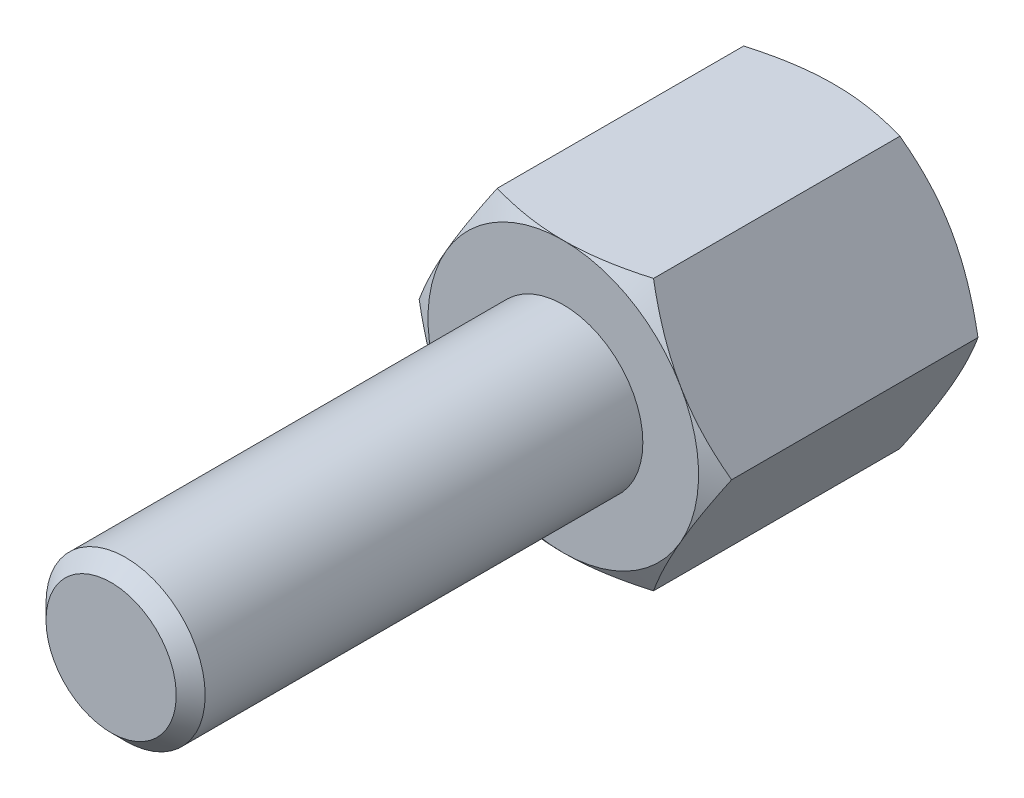
ISO-10303-21;
HEADER;
FILE_DESCRIPTION(('STEP AP214'),'2;1');
FILE_NAME('part.step','',(''),(''),'','','');
FILE_SCHEMA(('AUTOMOTIVE_DESIGN { 1 0 10303 214 1 1 1 1 }'));
ENDSEC;
DATA;
#1=APPLICATION_CONTEXT('core data for automotive mechanical design processes');
#2=APPLICATION_PROTOCOL_DEFINITION('international standard','automotive_design',2000,#1);
#3=PRODUCT_CONTEXT('',#1,'mechanical');
#4=PRODUCT('Part','Part','',(#3));
#5=PRODUCT_RELATED_PRODUCT_CATEGORY('part','',(#4));
#6=PRODUCT_DEFINITION_FORMATION('','',#4);
#7=PRODUCT_DEFINITION_CONTEXT('part definition',#1,'design');
#8=PRODUCT_DEFINITION('design','',#6,#7);
#9=PRODUCT_DEFINITION_SHAPE('','',#8);
#10=(LENGTH_UNIT() NAMED_UNIT(*) SI_UNIT(.MILLI.,.METRE.));
#11=(NAMED_UNIT(*) PLANE_ANGLE_UNIT() SI_UNIT($,.RADIAN.));
#12=(NAMED_UNIT(*) SI_UNIT($,.STERADIAN.) SOLID_ANGLE_UNIT());
#13=UNCERTAINTY_MEASURE_WITH_UNIT(LENGTH_MEASURE(1.E-05),#10,'distance_accuracy_value','');
#14=(GEOMETRIC_REPRESENTATION_CONTEXT(3) GLOBAL_UNCERTAINTY_ASSIGNED_CONTEXT((#13)) GLOBAL_UNIT_ASSIGNED_CONTEXT((#10,
#11,#12)) REPRESENTATION_CONTEXT('',''));
#15=CARTESIAN_POINT('',(0.,0.,0.));
#16=DIRECTION('',(0.,0.,1.));
#17=DIRECTION('',(1.,0.,0.));
#18=AXIS2_PLACEMENT_3D('',#15,#16,#17);
#19=CARTESIAN_POINT('',(0.,0.,3.9751));
#20=DIRECTION('',(0.,0.,-1.));
#21=DIRECTION('',(-1.,0.,0.));
#22=AXIS2_PLACEMENT_3D('',#19,#20,#21);
#23=CONICAL_SURFACE('',#22,1.0795,1.02974425867666);
#24=CARTESIAN_POINT('',(0.,0.,4.62372903824024));
#25=VERTEX_POINT('',#24);
#26=VERTEX_LOOP('',#25);
#27=FACE_BOUND('',#26,.T.);
#28=CARTESIAN_POINT('',(0.,0.,3.9751));
#29=DIRECTION('',(0.,0.,-1.));
#30=DIRECTION('',(-1.,0.,0.));
#31=AXIS2_PLACEMENT_3D('',#28,#29,#30);
#32=CIRCLE('',#31,1.0795);
#33=CARTESIAN_POINT('',(-1.0795,0.,3.9751));
#34=VERTEX_POINT('',#33);
#35=EDGE_CURVE('E123',#34,#34,#32,.T.);
#36=ORIENTED_EDGE('',*,*,#35,.T.);
#37=EDGE_LOOP('',(#36));
#38=FACE_BOUND('',#37,.T.);
#39=ADVANCED_FACE('F17',(#27,#38),#23,.F.);
#40=CARTESIAN_POINT('',(0.,0.,-2.1209));
#41=DIRECTION('',(0.,0.,1.));
#42=DIRECTION('',(0.,-1.,0.));
#43=AXIS2_PLACEMENT_3D('',#40,#41,#42);
#44=CYLINDRICAL_SURFACE('',#43,1.0795);
#45=CARTESIAN_POINT('',(0.,0.,-2.1208999998521));
#46=DIRECTION('',(0.,0.,-1.));
#47=DIRECTION('',(1.,0.,0.));
#48=AXIS2_PLACEMENT_3D('',#45,#46,#47);
#49=CIRCLE('',#48,1.0795000001167);
#50=CARTESIAN_POINT('',(1.0795000001167,0.,-2.1208999998521));
#51=VERTEX_POINT('',#50);
#52=EDGE_CURVE('E129',#51,#51,#49,.T.);
#53=ORIENTED_EDGE('',*,*,#52,.T.);
#54=EDGE_LOOP('',(#53));
#55=FACE_BOUND('',#54,.T.);
#56=ORIENTED_EDGE('',*,*,#35,.F.);
#57=EDGE_LOOP('',(#56));
#58=FACE_BOUND('',#57,.T.);
#59=ADVANCED_FACE('F119',(#55,#58),#44,.F.);
#60=CARTESIAN_POINT('',(0.,0.,-2.3749));
#61=DIRECTION('',(0.,0.,1.));
#62=DIRECTION('',(1.,0.,0.));
#63=AXIS2_PLACEMENT_3D('',#60,#61,#62);
#64=CONICAL_SURFACE('',#63,2.3749,1.04719755119661);
#65=CARTESIAN_POINT('',(0.,0.,-2.3749));
#66=DIRECTION('',(0.,0.,1.));
#67=DIRECTION('',(1.,0.,0.));
#68=AXIS2_PLACEMENT_3D('',#65,#66,#67);
#69=CIRCLE('',#68,2.3749);
#70=CARTESIAN_POINT('',(0.,-2.3749,-2.3749));
#71=VERTEX_POINT('',#70);
#72=CARTESIAN_POINT('',(2.05672373144766,-1.18745,-2.3749));
#73=VERTEX_POINT('',#72);
#74=EDGE_CURVE('E221',#71,#73,#69,.T.);
#75=ORIENTED_EDGE('',*,*,#74,.T.);
#76=CARTESIAN_POINT('',(1.37114915429844,-2.3749,-2.16278248763178));
#77=CARTESIAN_POINT('',(1.42696435756434,-2.27822523210867,-2.19500732392759));
#78=CARTESIAN_POINT('',(1.48321187165236,-2.18080167990879,-2.22453452117387));
#79=CARTESIAN_POINT('',(1.59620283284149,-1.98509559433317,-2.27660548538834));
#80=CARTESIAN_POINT('',(1.65294233813021,-1.88681988837678,-2.29918378386987));
#81=CARTESIAN_POINT('',(1.76717792611216,-1.68895804595954,-2.33614417305783));
#82=CARTESIAN_POINT('',(1.82467478144418,-1.58937057124904,-2.35051710222379));
#83=CARTESIAN_POINT('',(1.91135131890353,-1.4392424045453,-2.36506149255085));
#84=CARTESIAN_POINT('',(1.94039073995329,-1.38894465186474,-2.36874080368445));
#85=CARTESIAN_POINT('',(1.99852669435416,-1.28825022509592,-2.37366400935876));
#86=CARTESIAN_POINT('',(2.02762323787449,-1.23785353339407,-2.37490742157294));
#87=CARTESIAN_POINT('',(2.05672373144766,-1.18745,-2.3749));
#88=B_SPLINE_CURVE_WITH_KNOTS('',3,(#76,#77,#78,#79,#80,#81,#82,#83,#84,#85,#86,#87),
.UNSPECIFIED.,.F.,.F.,(4,2,2,2,2,4),(0.,0.348652732002403,0.695543818108531,1.04282146478411,
1.21736185915432,1.39193681035822),.UNSPECIFIED.);
#89=CARTESIAN_POINT('',(1.37114915429844,-2.3749,-2.16278248763178));
#90=VERTEX_POINT('',#89);
#91=EDGE_CURVE('E22',#90,#73,#88,.T.);
#92=ORIENTED_EDGE('',*,*,#91,.F.);
#93=CARTESIAN_POINT('',(0.,-2.3749,-2.3749));
#94=CARTESIAN_POINT('',(0.0582009871463456,-2.3749,-2.37490742157294));
#95=CARTESIAN_POINT('',(0.116394074187004,-2.3749,-2.37366400935876));
#96=CARTESIAN_POINT('',(0.232665982988754,-2.3749,-2.36874080368445));
#97=CARTESIAN_POINT('',(0.290744825088262,-2.3749,-2.36506149255085));
#98=CARTESIAN_POINT('',(0.464097900006965,-2.3749,-2.35051710222379));
#99=CARTESIAN_POINT('',(0.579091610671009,-2.3749,-2.33614417305783));
#100=CARTESIAN_POINT('',(0.807562786634905,-2.3749,-2.29918378386987));
#101=CARTESIAN_POINT('',(0.921041797212354,-2.3749,-2.27660548538834));
#102=CARTESIAN_POINT('',(1.14702371959061,-2.3749,-2.22453452117387));
#103=CARTESIAN_POINT('',(1.25951874776664,-2.3749,-2.19500732392759));
#104=CARTESIAN_POINT('',(1.37114915429844,-2.3749,-2.16278248763178));
#105=B_SPLINE_CURVE_WITH_KNOTS('',3,(#93,#94,#95,#96,#97,#98,#99,#100,#101,#102,#103,#104),
.UNSPECIFIED.,.F.,.F.,(4,2,2,2,2,4),(0.,0.174574951203908,0.349115345574114,0.696392992249693,
1.04328407835582,1.39193681035822),.UNSPECIFIED.);
#106=EDGE_CURVE('E113',#71,#90,#105,.T.);
#107=ORIENTED_EDGE('',*,*,#106,.F.);
#108=EDGE_LOOP('',(#75,#92,#107));
#109=FACE_BOUND('',#108,.T.);
#110=ADVANCED_FACE('F490',(#109),#64,.T.);
#111=CARTESIAN_POINT('',(0.,0.,-2.3749));
#112=DIRECTION('',(0.,0.,1.));
#113=DIRECTION('',(1.,0.,0.));
#114=AXIS2_PLACEMENT_3D('',#111,#112,#113);
#115=CONICAL_SURFACE('',#114,2.3749,1.04719755119661);
#116=CARTESIAN_POINT('',(0.,0.,-2.3749));
#117=DIRECTION('',(0.,0.,1.));
#118=DIRECTION('',(1.,0.,0.));
#119=AXIS2_PLACEMENT_3D('',#116,#117,#118);
#120=CIRCLE('',#119,2.3749);
#121=CARTESIAN_POINT('',(2.05672373144766,1.18745,-2.3749));
#122=VERTEX_POINT('',#121);
#123=CARTESIAN_POINT('',(0.,2.3749,-2.3749));
#124=VERTEX_POINT('',#123);
#125=EDGE_CURVE('E561',#122,#124,#120,.T.);
#126=ORIENTED_EDGE('',*,*,#125,.T.);
#127=CARTESIAN_POINT('',(1.37114915429844,2.3749,-2.16278248763178));
#128=CARTESIAN_POINT('',(1.25951874776664,2.3749,-2.19500732392759));
#129=CARTESIAN_POINT('',(1.14702371959061,2.3749,-2.22453452117387));
#130=CARTESIAN_POINT('',(0.921041797212353,2.3749,-2.27660548538834));
#131=CARTESIAN_POINT('',(0.807562786634905,2.3749,-2.29918378386987));
#132=CARTESIAN_POINT('',(0.579091610671009,2.3749,-2.33614417305783));
#133=CARTESIAN_POINT('',(0.464097900006964,2.3749,-2.35051710222379));
#134=CARTESIAN_POINT('',(0.290744825088261,2.3749,-2.36506149255085));
#135=CARTESIAN_POINT('',(0.232665982988753,2.3749,-2.36874080368445));
#136=CARTESIAN_POINT('',(0.116394074187004,2.3749,-2.37366400935876));
#137=CARTESIAN_POINT('',(0.0582009871463452,2.3749,-2.37490742157294));
#138=CARTESIAN_POINT('',(0.,2.3749,-2.3749));
#139=B_SPLINE_CURVE_WITH_KNOTS('',3,(#127,#128,#129,#130,#131,#132,#133,#134,#135,#136,#137,
#138),.UNSPECIFIED.,.F.,.F.,(4,2,2,2,2,4),(0.,0.348652732002403,0.69554381810853,
1.04282146478411,1.21736185915432,1.39193681035822),.UNSPECIFIED.);
#140=CARTESIAN_POINT('',(1.37114915429844,2.3749,-2.16278248763178));
#141=VERTEX_POINT('',#140);
#142=EDGE_CURVE('E517',#141,#124,#139,.T.);
#143=ORIENTED_EDGE('',*,*,#142,.F.);
#144=CARTESIAN_POINT('',(2.05672373144766,1.18745,-2.3749));
#145=CARTESIAN_POINT('',(2.02762323787449,1.23785353339407,-2.37490742157294));
#146=CARTESIAN_POINT('',(1.99852669435416,1.28825022509592,-2.37366400935876));
#147=CARTESIAN_POINT('',(1.94039073995329,1.38894465186474,-2.36874080368445));
#148=CARTESIAN_POINT('',(1.91135131890353,1.4392424045453,-2.36506149255085));
#149=CARTESIAN_POINT('',(1.82467478144418,1.58937057124904,-2.35051710222379));
#150=CARTESIAN_POINT('',(1.76717792611216,1.68895804595954,-2.33614417305783));
#151=CARTESIAN_POINT('',(1.65294233813021,1.88681988837678,-2.29918378386987));
#152=CARTESIAN_POINT('',(1.59620283284149,1.98509559433317,-2.27660548538834));
#153=CARTESIAN_POINT('',(1.48321187165236,2.18080167990879,-2.22453452117387));
#154=CARTESIAN_POINT('',(1.42696435756434,2.27822523210867,-2.19500732392759));
#155=CARTESIAN_POINT('',(1.37114915429844,2.3749,-2.16278248763178));
#156=B_SPLINE_CURVE_WITH_KNOTS('',3,(#144,#145,#146,#147,#148,#149,#150,#151,#152,#153,#154,
#155),.UNSPECIFIED.,.F.,.F.,(4,2,2,2,2,4),(0.,0.174574951203908,0.349115345574114,
0.696392992249693,1.04328407835582,1.39193681035822),.UNSPECIFIED.);
#157=EDGE_CURVE('E521',#122,#141,#156,.T.);
#158=ORIENTED_EDGE('',*,*,#157,.F.);
#159=EDGE_LOOP('',(#126,#143,#158));
#160=FACE_BOUND('',#159,.T.);
#161=ADVANCED_FACE('F483',(#160),#115,.T.);
#162=CARTESIAN_POINT('',(0.,0.,-2.3749));
#163=DIRECTION('',(0.,0.,1.));
#164=DIRECTION('',(1.,0.,0.));
#165=AXIS2_PLACEMENT_3D('',#162,#163,#164);
#166=CONICAL_SURFACE('',#165,2.3749,1.04719755119661);
#167=CARTESIAN_POINT('',(0.,0.,-2.3749));
#168=DIRECTION('',(0.,0.,1.));
#169=DIRECTION('',(1.,0.,0.));
#170=AXIS2_PLACEMENT_3D('',#167,#168,#169);
#171=CIRCLE('',#170,2.3749);
#172=CARTESIAN_POINT('',(-2.05672373144766,1.18745,-2.3749));
#173=VERTEX_POINT('',#172);
#174=EDGE_CURVE('E549',#124,#173,#171,.T.);
#175=ORIENTED_EDGE('',*,*,#174,.T.);
#176=CARTESIAN_POINT('',(-1.37114915429844,2.3749,-2.16278248763178));
#177=CARTESIAN_POINT('',(-1.42696435756434,2.27822523210867,-2.19500732392759));
#178=CARTESIAN_POINT('',(-1.48321187165236,2.18080167990879,-2.22453452117387));
#179=CARTESIAN_POINT('',(-1.59620283284149,1.98509559433317,-2.27660548538834));
#180=CARTESIAN_POINT('',(-1.65294233813021,1.88681988837678,-2.29918378386987));
#181=CARTESIAN_POINT('',(-1.76717792611216,1.68895804595954,-2.33614417305783));
#182=CARTESIAN_POINT('',(-1.82467478144418,1.58937057124904,-2.35051710222379));
#183=CARTESIAN_POINT('',(-1.91135131890353,1.4392424045453,-2.36506149255085));
#184=CARTESIAN_POINT('',(-1.94039073995329,1.38894465186474,-2.36874080368445));
#185=CARTESIAN_POINT('',(-1.99852669435416,1.28825022509592,-2.37366400935876));
#186=CARTESIAN_POINT('',(-2.02762323787449,1.23785353339407,-2.37490742157294));
#187=CARTESIAN_POINT('',(-2.05672373144766,1.18745,-2.3749));
#188=B_SPLINE_CURVE_WITH_KNOTS('',3,(#176,#177,#178,#179,#180,#181,#182,#183,#184,#185,#186,
#187),.UNSPECIFIED.,.F.,.F.,(4,2,2,2,2,4),(0.,0.348652732002402,0.69554381810853,
1.04282146478411,1.21736185915432,1.39193681035822),.UNSPECIFIED.);
#189=CARTESIAN_POINT('',(-1.37114915429844,2.3749,-2.16278248763178));
#190=VERTEX_POINT('',#189);
#191=EDGE_CURVE('E526',#190,#173,#188,.T.);
#192=ORIENTED_EDGE('',*,*,#191,.F.);
#193=CARTESIAN_POINT('',(0.,2.3749,-2.3749));
#194=CARTESIAN_POINT('',(-0.0582009871463459,2.3749,-2.37490742157294));
#195=CARTESIAN_POINT('',(-0.116394074187004,2.3749,-2.37366400935876));
#196=CARTESIAN_POINT('',(-0.232665982988754,2.3749,-2.36874080368445));
#197=CARTESIAN_POINT('',(-0.290744825088262,2.3749,-2.36506149255085));
#198=CARTESIAN_POINT('',(-0.464097900006965,2.3749,-2.35051710222379));
#199=CARTESIAN_POINT('',(-0.579091610671009,2.3749,-2.33614417305783));
#200=CARTESIAN_POINT('',(-0.807562786634906,2.3749,-2.29918378386987));
#201=CARTESIAN_POINT('',(-0.921041797212354,2.3749,-2.27660548538834));
#202=CARTESIAN_POINT('',(-1.14702371959061,2.3749,-2.22453452117387));
#203=CARTESIAN_POINT('',(-1.25951874776664,2.3749,-2.19500732392759));
#204=CARTESIAN_POINT('',(-1.37114915429844,2.3749,-2.16278248763178));
#205=B_SPLINE_CURVE_WITH_KNOTS('',3,(#193,#194,#195,#196,#197,#198,#199,#200,#201,#202,#203,
#204),.UNSPECIFIED.,.F.,.F.,(4,2,2,2,2,4),(0.,0.174574951203908,0.349115345574114,
0.696392992249693,1.04328407835582,1.39193681035822),.UNSPECIFIED.);
#206=EDGE_CURVE('E530',#124,#190,#205,.T.);
#207=ORIENTED_EDGE('',*,*,#206,.F.);
#208=EDGE_LOOP('',(#175,#192,#207));
#209=FACE_BOUND('',#208,.T.);
#210=ADVANCED_FACE('F206',(#209),#166,.T.);
#211=CARTESIAN_POINT('',(0.,0.,-2.3749));
#212=DIRECTION('',(0.,0.,1.));
#213=DIRECTION('',(1.,0.,0.));
#214=AXIS2_PLACEMENT_3D('',#211,#212,#213);
#215=CONICAL_SURFACE('',#214,2.3749,1.04719755119661);
#216=CARTESIAN_POINT('',(-2.74229830859688,0.,-2.16278248763178));
#217=CARTESIAN_POINT('',(-2.68648310533098,-0.0966747678913262,-2.19500732392759));
#218=CARTESIAN_POINT('',(-2.63023559124297,-0.194098320091214,-2.22453452117387));
#219=CARTESIAN_POINT('',(-2.51724463005384,-0.389804405666826,-2.27660548538834));
#220=CARTESIAN_POINT('',(-2.46050512476512,-0.488080111623219,-2.29918378386987));
#221=CARTESIAN_POINT('',(-2.34626953678317,-0.685941954040458,-2.33614417305783));
#222=CARTESIAN_POINT('',(-2.28877268145115,-0.785529428750958,-2.35051710222379));
#223=CARTESIAN_POINT('',(-2.20209614399179,-0.935657595454702,-2.36506149255085));
#224=CARTESIAN_POINT('',(-2.17305672294204,-0.985955348135261,-2.36874080368445));
#225=CARTESIAN_POINT('',(-2.11492076854117,-1.08664977490408,-2.37366400935876));
#226=CARTESIAN_POINT('',(-2.08582422502084,-1.13704646660593,-2.37490742157294));
#227=CARTESIAN_POINT('',(-2.05672373144766,-1.18745,-2.3749));
#228=B_SPLINE_CURVE_WITH_KNOTS('',3,(#216,#217,#218,#219,#220,#221,#222,#223,#224,#225,#226,
#227),.UNSPECIFIED.,.F.,.F.,(4,2,2,2,2,4),(0.,0.348652732002403,0.69554381810853,
1.04282146478411,1.21736185915432,1.39193681035822),.UNSPECIFIED.);
#229=CARTESIAN_POINT('',(-2.74229830859688,0.,-2.16278248763178));
#230=VERTEX_POINT('',#229);
#231=CARTESIAN_POINT('',(-2.05672373144766,-1.18745,-2.3749));
#232=VERTEX_POINT('',#231);
#233=EDGE_CURVE('E190',#230,#232,#228,.T.);
#234=ORIENTED_EDGE('',*,*,#233,.F.);
#235=CARTESIAN_POINT('',(-2.05672373144766,1.18745,-2.3749));
#236=CARTESIAN_POINT('',(-2.08582422502084,1.13704646660593,-2.37490742157294));
#237=CARTESIAN_POINT('',(-2.11492076854117,1.08664977490408,-2.37366400935876));
#238=CARTESIAN_POINT('',(-2.17305672294204,0.985955348135262,-2.36874080368445));
#239=CARTESIAN_POINT('',(-2.20209614399179,0.935657595454703,-2.36506149255085));
#240=CARTESIAN_POINT('',(-2.28877268145115,0.785529428750959,-2.35051710222379));
#241=CARTESIAN_POINT('',(-2.34626953678317,0.685941954040459,-2.33614417305783));
#242=CARTESIAN_POINT('',(-2.46050512476512,0.48808011162322,-2.29918378386987));
#243=CARTESIAN_POINT('',(-2.51724463005384,0.389804405666827,-2.27660548538834));
#244=CARTESIAN_POINT('',(-2.63023559124297,0.194098320091214,-2.22453452117387));
#245=CARTESIAN_POINT('',(-2.68648310533098,0.0966747678913266,-2.19500732392759));
#246=CARTESIAN_POINT('',(-2.74229830859688,0.,-2.16278248763178));
#247=B_SPLINE_CURVE_WITH_KNOTS('',3,(#235,#236,#237,#238,#239,#240,#241,#242,#243,#244,#245,
#246),.UNSPECIFIED.,.F.,.F.,(4,2,2,2,2,4),(0.,0.174574951203908,0.349115345574114,
0.696392992249693,1.04328407835582,1.39193681035822),.UNSPECIFIED.);
#248=EDGE_CURVE('E196',#173,#230,#247,.T.);
#249=ORIENTED_EDGE('',*,*,#248,.F.);
#250=CARTESIAN_POINT('',(0.,0.,-2.3749));
#251=DIRECTION('',(0.,0.,1.));
#252=DIRECTION('',(1.,0.,0.));
#253=AXIS2_PLACEMENT_3D('',#250,#251,#252);
#254=CIRCLE('',#253,2.3749);
#255=EDGE_CURVE('E543',#173,#232,#254,.T.);
#256=ORIENTED_EDGE('',*,*,#255,.T.);
#257=EDGE_LOOP('',(#234,#249,#256));
#258=FACE_BOUND('',#257,.T.);
#259=ADVANCED_FACE('F201',(#258),#215,.T.);
#260=CARTESIAN_POINT('',(0.,0.,-2.3749));
#261=DIRECTION('',(0.,0.,1.));
#262=DIRECTION('',(1.,0.,0.));
#263=AXIS2_PLACEMENT_3D('',#260,#261,#262);
#264=CONICAL_SURFACE('',#263,2.3749,1.04719755119661);
#265=CARTESIAN_POINT('',(-1.37114915429844,-2.3749,-2.16278248763178));
#266=CARTESIAN_POINT('',(-1.25951874776664,-2.3749,-2.19500732392759));
#267=CARTESIAN_POINT('',(-1.14702371959061,-2.3749,-2.22453452117387));
#268=CARTESIAN_POINT('',(-0.921041797212353,-2.3749,-2.27660548538834));
#269=CARTESIAN_POINT('',(-0.807562786634905,-2.3749,-2.29918378386987));
#270=CARTESIAN_POINT('',(-0.579091610671009,-2.3749,-2.33614417305783));
#271=CARTESIAN_POINT('',(-0.464097900006964,-2.3749,-2.35051710222379));
#272=CARTESIAN_POINT('',(-0.290744825088261,-2.3749,-2.36506149255085));
#273=CARTESIAN_POINT('',(-0.232665982988753,-2.3749,-2.36874080368445));
#274=CARTESIAN_POINT('',(-0.116394074187004,-2.3749,-2.37366400935876));
#275=CARTESIAN_POINT('',(-0.0582009871463451,-2.3749,-2.37490742157294));
#276=CARTESIAN_POINT('',(0.,-2.3749,-2.3749));
#277=B_SPLINE_CURVE_WITH_KNOTS('',3,(#265,#266,#267,#268,#269,#270,#271,#272,#273,#274,#275,
#276),.UNSPECIFIED.,.F.,.F.,(4,2,2,2,2,4),(0.,0.348652732002403,0.695543818108531,
1.04282146478411,1.21736185915432,1.39193681035822),.UNSPECIFIED.);
#278=CARTESIAN_POINT('',(-1.37114915429844,-2.3749,-2.16278248763178));
#279=VERTEX_POINT('',#278);
#280=EDGE_CURVE('E216',#279,#71,#277,.T.);
#281=ORIENTED_EDGE('',*,*,#280,.F.);
#282=CARTESIAN_POINT('',(-2.05672373144766,-1.18745,-2.3749));
#283=CARTESIAN_POINT('',(-2.02762323787449,-1.23785353339407,-2.37490742157294));
#284=CARTESIAN_POINT('',(-1.99852669435416,-1.28825022509592,-2.37366400935876));
#285=CARTESIAN_POINT('',(-1.94039073995329,-1.38894465186474,-2.36874080368445));
#286=CARTESIAN_POINT('',(-1.91135131890353,-1.4392424045453,-2.36506149255085));
#287=CARTESIAN_POINT('',(-1.82467478144418,-1.58937057124904,-2.35051710222379));
#288=CARTESIAN_POINT('',(-1.76717792611216,-1.68895804595954,-2.33614417305783));
#289=CARTESIAN_POINT('',(-1.65294233813021,-1.88681988837678,-2.29918378386987));
#290=CARTESIAN_POINT('',(-1.59620283284149,-1.98509559433317,-2.27660548538834));
#291=CARTESIAN_POINT('',(-1.48321187165236,-2.18080167990879,-2.22453452117387));
#292=CARTESIAN_POINT('',(-1.42696435756434,-2.27822523210867,-2.19500732392759));
#293=CARTESIAN_POINT('',(-1.37114915429844,-2.3749,-2.16278248763178));
#294=B_SPLINE_CURVE_WITH_KNOTS('',3,(#282,#283,#284,#285,#286,#287,#288,#289,#290,#291,#292,
#293),.UNSPECIFIED.,.F.,.F.,(4,2,2,2,2,4),(0.,0.174574951203908,0.349115345574115,
0.696392992249693,1.04328407835582,1.39193681035822),.UNSPECIFIED.);
#295=EDGE_CURVE('E183',#232,#279,#294,.T.);
#296=ORIENTED_EDGE('',*,*,#295,.F.);
#297=CARTESIAN_POINT('',(0.,0.,-2.3749));
#298=DIRECTION('',(0.,0.,1.));
#299=DIRECTION('',(1.,0.,0.));
#300=AXIS2_PLACEMENT_3D('',#297,#298,#299);
#301=CIRCLE('',#300,2.3749);
#302=EDGE_CURVE('E548',#232,#71,#301,.T.);
#303=ORIENTED_EDGE('',*,*,#302,.T.);
#304=EDGE_LOOP('',(#281,#296,#303));
#305=FACE_BOUND('',#304,.T.);
#306=ADVANCED_FACE('F205',(#305),#264,.T.);
#307=CARTESIAN_POINT('',(0.,0.,-2.37490000006346));
#308=DIRECTION('',(0.,0.,-1.));
#309=DIRECTION('',(-1.,0.,0.));
#310=AXIS2_PLACEMENT_3D('',#307,#308,#309);
#311=CONICAL_SURFACE('',#310,1.33349999987331,0.785398162502276);
#312=ORIENTED_EDGE('',*,*,#52,.F.);
#313=EDGE_LOOP('',(#312));
#314=FACE_BOUND('',#313,.T.);
#315=CARTESIAN_POINT('',(0.,0.,-2.37490000006346));
#316=DIRECTION('',(0.,0.,-1.));
#317=DIRECTION('',(-1.,0.,0.));
#318=AXIS2_PLACEMENT_3D('',#315,#316,#317);
#319=CIRCLE('',#318,1.33349999987331);
#320=CARTESIAN_POINT('',(-1.33349999987331,0.,-2.37490000006346));
#321=VERTEX_POINT('',#320);
#322=EDGE_CURVE('E557',#321,#321,#319,.T.);
#323=ORIENTED_EDGE('',*,*,#322,.T.);
#324=EDGE_LOOP('',(#323));
#325=FACE_BOUND('',#324,.T.);
#326=ADVANCED_FACE('F213',(#314,#325),#311,.F.);
#327=CARTESIAN_POINT('',(0.,0.,-2.3749));
#328=DIRECTION('',(0.,0.,1.));
#329=DIRECTION('',(1.,0.,0.));
#330=AXIS2_PLACEMENT_3D('',#327,#328,#329);
#331=PLANE('',#330);
#332=ORIENTED_EDGE('',*,*,#322,.F.);
#333=EDGE_LOOP('',(#332));
#334=FACE_BOUND('',#333,.T.);
#335=ORIENTED_EDGE('',*,*,#255,.F.);
#336=ORIENTED_EDGE('',*,*,#174,.F.);
#337=ORIENTED_EDGE('',*,*,#125,.F.);
#338=CARTESIAN_POINT('',(0.,0.,-2.3749));
#339=DIRECTION('',(0.,0.,1.));
#340=DIRECTION('',(1.,0.,0.));
#341=AXIS2_PLACEMENT_3D('',#338,#339,#340);
#342=CIRCLE('',#341,2.3749);
#343=EDGE_CURVE('E279',#122,#73,#342,.F.);
#344=ORIENTED_EDGE('',*,*,#343,.T.);
#345=ORIENTED_EDGE('',*,*,#74,.F.);
#346=ORIENTED_EDGE('',*,*,#302,.F.);
#347=EDGE_LOOP('',(#335,#336,#337,#344,#345,#346));
#348=FACE_BOUND('',#347,.T.);
#349=ADVANCED_FACE('F292',(#334,#348),#331,.F.);
#350=CARTESIAN_POINT('',(0.,0.,-2.3749));
#351=DIRECTION('',(0.,0.,1.));
#352=DIRECTION('',(1.,0.,0.));
#353=AXIS2_PLACEMENT_3D('',#350,#351,#352);
#354=CONICAL_SURFACE('',#353,2.3749,1.04719755119661);
#355=ORIENTED_EDGE('',*,*,#343,.F.);
#356=CARTESIAN_POINT('',(2.74229830859688,0.,-2.16278248763178));
#357=CARTESIAN_POINT('',(2.68648310533098,0.0966747678913255,-2.19500732392759));
#358=CARTESIAN_POINT('',(2.63023559124297,0.194098320091213,-2.22453452117387));
#359=CARTESIAN_POINT('',(2.51724463005384,0.389804405666826,-2.27660548538834));
#360=CARTESIAN_POINT('',(2.46050512476512,0.488080111623219,-2.29918378386987));
#361=CARTESIAN_POINT('',(2.34626953678317,0.685941954040458,-2.33614417305783));
#362=CARTESIAN_POINT('',(2.28877268145115,0.785529428750958,-2.35051710222379));
#363=CARTESIAN_POINT('',(2.20209614399179,0.935657595454702,-2.36506149255085));
#364=CARTESIAN_POINT('',(2.17305672294204,0.985955348135261,-2.36874080368445));
#365=CARTESIAN_POINT('',(2.11492076854117,1.08664977490408,-2.37366400935876));
#366=CARTESIAN_POINT('',(2.08582422502084,1.13704646660593,-2.37490742157294));
#367=CARTESIAN_POINT('',(2.05672373144766,1.18745,-2.3749));
#368=B_SPLINE_CURVE_WITH_KNOTS('',3,(#356,#357,#358,#359,#360,#361,#362,#363,#364,#365,#366,
#367),.UNSPECIFIED.,.F.,.F.,(4,2,2,2,2,4),(0.,0.348652732002403,0.695543818108531,
1.04282146478411,1.21736185915432,1.39193681035822),.UNSPECIFIED.);
#369=CARTESIAN_POINT('',(2.74229830859688,0.,-2.16278248763178));
#370=VERTEX_POINT('',#369);
#371=EDGE_CURVE('E298',#370,#122,#368,.T.);
#372=ORIENTED_EDGE('',*,*,#371,.F.);
#373=CARTESIAN_POINT('',(2.05672373144766,-1.18745,-2.3749));
#374=CARTESIAN_POINT('',(2.08582422502084,-1.13704646660593,-2.37490742157294));
#375=CARTESIAN_POINT('',(2.11492076854117,-1.08664977490408,-2.37366400935876));
#376=CARTESIAN_POINT('',(2.17305672294204,-0.985955348135262,-2.36874080368445));
#377=CARTESIAN_POINT('',(2.20209614399179,-0.935657595454703,-2.36506149255085));
#378=CARTESIAN_POINT('',(2.28877268145115,-0.785529428750959,-2.35051710222379));
#379=CARTESIAN_POINT('',(2.34626953678317,-0.685941954040459,-2.33614417305783));
#380=CARTESIAN_POINT('',(2.46050512476512,-0.48808011162322,-2.29918378386987));
#381=CARTESIAN_POINT('',(2.51724463005384,-0.389804405666827,-2.27660548538834));
#382=CARTESIAN_POINT('',(2.63023559124297,-0.194098320091214,-2.22453452117387));
#383=CARTESIAN_POINT('',(2.68648310533098,-0.0966747678913261,-2.19500732392759));
#384=CARTESIAN_POINT('',(2.74229830859688,0.,-2.16278248763178));
#385=B_SPLINE_CURVE_WITH_KNOTS('',3,(#373,#374,#375,#376,#377,#378,#379,#380,#381,#382,#383,
#384),.UNSPECIFIED.,.F.,.F.,(4,2,2,2,2,4),(0.,0.174574951203908,0.349115345574115,
0.696392992249693,1.04328407835582,1.39193681035822),.UNSPECIFIED.);
#386=EDGE_CURVE('E304',#73,#370,#385,.T.);
#387=ORIENTED_EDGE('',*,*,#386,.F.);
#388=EDGE_LOOP('',(#355,#372,#387));
#389=FACE_BOUND('',#388,.T.);
#390=ADVANCED_FACE('F19',(#389),#354,.T.);
#391=CARTESIAN_POINT('',(1.37114915429844,2.3749,0.));
#392=DIRECTION('',(0.866025403784439,0.5,0.));
#393=DIRECTION('',(-0.5,0.866025403784439,0.));
#394=AXIS2_PLACEMENT_3D('',#391,#392,#393);
#395=PLANE('',#394);
#396=DIRECTION('',(0.,0.,1.));
#397=VECTOR('',#396,1.);
#398=CARTESIAN_POINT('',(2.74229830859688,0.,0.));
#399=LINE('',#398,#397);
#400=CARTESIAN_POINT('',(2.7422983084486,0.,2.16278248660445));
#401=VERTEX_POINT('',#400);
#402=EDGE_CURVE('E310',#370,#401,#399,.T.);
#403=ORIENTED_EDGE('',*,*,#402,.F.);
#404=ORIENTED_EDGE('',*,*,#371,.T.);
#405=ORIENTED_EDGE('',*,*,#157,.T.);
#406=DIRECTION('',(0.,0.,1.));
#407=VECTOR('',#406,1.);
#408=CARTESIAN_POINT('',(1.37114915429844,2.3749,0.));
#409=LINE('',#408,#407);
#410=CARTESIAN_POINT('',(1.37114915437258,2.37489999987158,2.16278248656165));
#411=VERTEX_POINT('',#410);
#412=EDGE_CURVE('E253',#411,#141,#409,.F.);
#413=ORIENTED_EDGE('',*,*,#412,.F.);
#414=CARTESIAN_POINT('',(1.37114915460691,2.37489999987708,2.16278248672875));
#415=CARTESIAN_POINT('',(1.42696435774967,2.27822523193485,2.19500732302171));
#416=CARTESIAN_POINT('',(1.48321187177808,2.18080167973032,2.2245345203077));
#417=CARTESIAN_POINT('',(1.5962028329051,1.9850955941839,2.27660548462765));
#418=CARTESIAN_POINT('',(1.65294233819101,1.88681988826118,2.29918378317492));
#419=CARTESIAN_POINT('',(1.76717792615774,1.6889580458909,2.33614417246414));
#420=CARTESIAN_POINT('',(1.82467478147737,1.58937057119362,2.35051710166539));
#421=CARTESIAN_POINT('',(1.91135131892375,1.43924240450924,2.36506149202994));
#422=CARTESIAN_POINT('',(1.94039073997035,1.38894465183466,2.36874080317348));
#423=CARTESIAN_POINT('',(1.9985266943651,1.28825022507749,2.37366400886112));
#424=CARTESIAN_POINT('',(2.02762323788245,1.23785353338131,2.3749074210787));
#425=CARTESIAN_POINT('',(2.05672373145206,1.18744999999239,2.37489999950529));
#426=B_SPLINE_CURVE_WITH_KNOTS('',3,(#414,#415,#416,#417,#418,#419,#420,#421,#422,#423,#424,
#425),.UNSPECIFIED.,.F.,.F.,(4,2,2,2,2,4),(0.,0.348652731956727,0.69554381801194,
1.04282146464504,1.21736185899676,1.39193681018155),.UNSPECIFIED.);
#427=CARTESIAN_POINT('',(2.05672373135207,1.18744999994481,2.37489999956901));
#428=VERTEX_POINT('',#427);
#429=EDGE_CURVE('E270',#411,#428,#426,.T.);
#430=ORIENTED_EDGE('',*,*,#429,.T.);
#431=CARTESIAN_POINT('',(2.05672373149334,1.18745000002637,2.37489999953574));
#432=CARTESIAN_POINT('',(2.08582422503463,1.13704646662091,2.37490742108949));
#433=CARTESIAN_POINT('',(2.1149207685398,1.0866497749171,2.37366400886377));
#434=CARTESIAN_POINT('',(2.17305672292546,0.985955348153327,2.36874080316998));
#435=CARTESIAN_POINT('',(2.20209614397517,0.93565759547978,2.3650614920284));
#436=CARTESIAN_POINT('',(2.28877268142806,0.785529428798354,2.35051710166556));
#437=CARTESIAN_POINT('',(2.34626953674876,0.685941954102161,2.33614417245992));
#438=CARTESIAN_POINT('',(2.46050512470718,0.488080111721456,2.2991837831746));
#439=CARTESIAN_POINT('',(2.51724462998368,0.38980440578728,2.27660548463542));
#440=CARTESIAN_POINT('',(2.63023559114579,0.194098320260599,2.22453452028977));
#441=CARTESIAN_POINT('',(2.68648310521896,0.0966747680874908,2.19500732296974));
#442=CARTESIAN_POINT('',(2.74229830846654,2.25757305632385E-10,2.1627824865941));
#443=B_SPLINE_CURVE_WITH_KNOTS('',3,(#431,#432,#433,#434,#435,#436,#437,#438,#439,#440,#441,
#442),.UNSPECIFIED.,.F.,.F.,(4,2,2,2,2,4),(0.,0.174574951186757,0.349115345540219,
0.696392992174321,1.04328407823871,1.39193681020734),.UNSPECIFIED.);
#444=EDGE_CURVE('E278',#428,#401,#443,.T.);
#445=ORIENTED_EDGE('',*,*,#444,.T.);
#446=EDGE_LOOP('',(#403,#404,#405,#413,#430,#445));
#447=FACE_BOUND('',#446,.T.);
#448=ADVANCED_FACE('F285',(#447),#395,.T.);
#449=CARTESIAN_POINT('',(2.74229830859688,0.,0.));
#450=DIRECTION('',(0.866025403784439,-0.5,0.));
#451=DIRECTION('',(0.5,0.866025403784439,0.));
#452=AXIS2_PLACEMENT_3D('',#449,#450,#451);
#453=PLANE('',#452);
#454=DIRECTION('',(0.,0.,-1.));
#455=VECTOR('',#454,1.);
#456=CARTESIAN_POINT('',(1.37114915429844,-2.3749,0.));
#457=LINE('',#456,#455);
#458=CARTESIAN_POINT('',(1.3711491542243,-2.37489999987158,2.16278248660445));
#459=VERTEX_POINT('',#458);
#460=EDGE_CURVE('E245',#90,#459,#457,.F.);
#461=ORIENTED_EDGE('',*,*,#460,.F.);
#462=ORIENTED_EDGE('',*,*,#91,.T.);
#463=ORIENTED_EDGE('',*,*,#386,.T.);
#464=ORIENTED_EDGE('',*,*,#402,.T.);
#465=CARTESIAN_POINT('',(2.74229830864467,-3.28598170889645E-10,2.16278248672875));
#466=CARTESIAN_POINT('',(2.68648310527311,-0.0966747681387353,2.19500732302172));
#467=CARTESIAN_POINT('',(2.63023559115127,-0.194098320289325,2.2245345203077));
#468=CARTESIAN_POINT('',(2.51724462995637,-0.389804405796548,2.27660548462765));
#469=CARTESIAN_POINT('',(2.4605051246954,-0.488080111733669,2.29918378317492));
#470=CARTESIAN_POINT('',(2.34626953674651,-0.685941954114258,2.33614417246414));
#471=CARTESIAN_POINT('',(2.28877268141975,-0.785529428807409,2.35051710166539));
#472=CARTESIAN_POINT('',(2.20209614397068,-0.935657595490238,2.36506149202994));
#473=CARTESIAN_POINT('',(2.17305672292453,-0.985955348165079,2.36874080317349));
#474=CARTESIAN_POINT('',(2.11492076853068,-1.08664977492277,2.37366400886112));
#475=CARTESIAN_POINT('',(2.08582422501377,-1.13704646661921,2.3749074210787));
#476=CARTESIAN_POINT('',(2.05672373144327,-1.18745000000761,2.37489999950529));
#477=B_SPLINE_CURVE_WITH_KNOTS('',3,(#465,#466,#467,#468,#469,#470,#471,#472,#473,#474,#475,
#476),.UNSPECIFIED.,.F.,.F.,(4,2,2,2,2,4),(0.,0.348652731956727,0.69554381801194,
1.04282146464504,1.21736185899676,1.39193681018155),.UNSPECIFIED.);
#478=CARTESIAN_POINT('',(2.05672373135207,-1.18744999994481,2.37489999956901));
#479=VERTEX_POINT('',#478);
#480=EDGE_CURVE('E311',#401,#479,#477,.T.);
#481=ORIENTED_EDGE('',*,*,#480,.T.);
#482=CARTESIAN_POINT('',(2.05672373149334,-1.18745000002637,2.37489999953573));
#483=CARTESIAN_POINT('',(2.02762323789436,-1.23785353339853,2.37490742108949));
#484=CARTESIAN_POINT('',(1.99852669436475,-1.28825022508823,2.37366400886377));
#485=CARTESIAN_POINT('',(1.94039073996064,-1.38894465184135,2.36874080316998));
#486=CARTESIAN_POINT('',(1.91135131891694,-1.43924240451836,2.3650614920284));
#487=CARTESIAN_POINT('',(1.82467478147368,-1.58937057120535,2.35051710166556));
#488=CARTESIAN_POINT('',(1.76717792614839,-1.6889580458989,2.33614417245992));
#489=CARTESIAN_POINT('',(1.65294233818632,-1.88681988827749,2.2991837831746));
#490=CARTESIAN_POINT('',(1.59620283291073,-1.98509559421219,2.27660548463542));
#491=CARTESIAN_POINT('',(1.48321187175046,-2.18080167973993,2.22453452028977));
#492=CARTESIAN_POINT('',(1.42696435767822,-2.27822523191358,2.19500732296973));
#493=CARTESIAN_POINT('',(1.37114915442878,-2.37489999977424,2.16278248659409));
#494=B_SPLINE_CURVE_WITH_KNOTS('',3,(#482,#483,#484,#485,#486,#487,#488,#489,#490,#491,#492,
#493),.UNSPECIFIED.,.F.,.F.,(4,2,2,2,2,4),(0.,0.174574951186757,0.349115345540218,
0.696392992174321,1.04328407823871,1.39193681020734),.UNSPECIFIED.);
#495=EDGE_CURVE('E316',#479,#459,#494,.T.);
#496=ORIENTED_EDGE('',*,*,#495,.T.);
#497=EDGE_LOOP('',(#461,#462,#463,#464,#481,#496));
#498=FACE_BOUND('',#497,.T.);
#499=ADVANCED_FACE('F289',(#498),#453,.T.);
#500=CARTESIAN_POINT('',(-1.37114915429844,2.3749,0.));
#501=DIRECTION('',(0.,1.,0.));
#502=DIRECTION('',(0.,0.,1.));
#503=AXIS2_PLACEMENT_3D('',#500,#501,#502);
#504=PLANE('',#503);
#505=CARTESIAN_POINT('',(0.,2.37490000005274,2.37489999953573));
#506=CARTESIAN_POINT('',(0.0582009871402723,2.37490000001944,2.37490742108949));
#507=CARTESIAN_POINT('',(0.116394074175049,2.37490000000532,2.37366400886377));
#508=CARTESIAN_POINT('',(0.232665982964819,2.37489999999468,2.36874080316998));
#509=CARTESIAN_POINT('',(0.290744825058229,2.37489999999814,2.3650614920284));
#510=CARTESIAN_POINT('',(0.464097899954373,2.3749000000037,2.35051710166556));
#511=CARTESIAN_POINT('',(0.579091610600371,2.37490000000106,2.33614417245992));
#512=CARTESIAN_POINT('',(0.807562786520861,2.37489999999894,2.2991837831746));
#513=CARTESIAN_POINT('',(0.921041797072959,2.37489999999947,2.27660548463542));
#514=CARTESIAN_POINT('',(1.14702371939533,2.37490000000053,2.22453452028977));
#515=CARTESIAN_POINT('',(1.25951874754074,2.37490000000107,2.19500732296973));
#516=CARTESIAN_POINT('',(1.37114915403776,2.3749,2.16278248659409));
#517=B_SPLINE_CURVE_WITH_KNOTS('',3,(#505,#506,#507,#508,#509,#510,#511,#512,#513,#514,#515,
#516),.UNSPECIFIED.,.F.,.F.,(4,2,2,2,2,4),(0.,0.174574951186757,0.349115345540219,
0.696392992174321,1.04328407823871,1.39193681020734),.UNSPECIFIED.);
#518=CARTESIAN_POINT('',(0.,2.37489999988962,2.37489999956901));
#519=VERTEX_POINT('',#518);
#520=EDGE_CURVE('E246',#519,#411,#517,.T.);
#521=ORIENTED_EDGE('',*,*,#520,.T.);
#522=ORIENTED_EDGE('',*,*,#412,.T.);
#523=ORIENTED_EDGE('',*,*,#142,.T.);
#524=ORIENTED_EDGE('',*,*,#206,.T.);
#525=DIRECTION('',(0.,0.,1.));
#526=VECTOR('',#525,1.);
#527=CARTESIAN_POINT('',(-1.37114915429844,2.3749,0.));
#528=LINE('',#527,#526);
#529=CARTESIAN_POINT('',(-1.37114915415016,2.3749,2.16278248656165));
#530=VERTEX_POINT('',#529);
#531=EDGE_CURVE('E327',#530,#190,#528,.F.);
#532=ORIENTED_EDGE('',*,*,#531,.F.);
#533=CARTESIAN_POINT('',(-1.37114915403776,2.37490000020568,2.16278248672875));
#534=CARTESIAN_POINT('',(-1.25951874752344,2.37490000007359,2.19500732302171));
#535=CARTESIAN_POINT('',(-1.14702371937319,2.37490000001965,2.2245345203077));
#536=CARTESIAN_POINT('',(-0.921041797051279,2.37489999998045,2.27660548462765));
#537=CARTESIAN_POINT('',(-0.807562786504399,2.37489999999485,2.29918378317492));
#538=CARTESIAN_POINT('',(-0.579091610588769,2.37490000000515,2.33614417246414));
#539=CARTESIAN_POINT('',(-0.464097899942379,2.37490000000103,2.35051710166539));
#540=CARTESIAN_POINT('',(-0.29074482504693,2.37489999999948,2.36506149202994));
#541=CARTESIAN_POINT('',(-0.232665982954174,2.37489999999974,2.36874080317348));
#542=CARTESIAN_POINT('',(-0.116394074165577,2.37490000000026,2.37366400886112));
#543=CARTESIAN_POINT('',(-0.05820098713132,2.37490000000052,2.3749074210787));
#544=CARTESIAN_POINT('',(8.78895355408087E-12,2.3749,2.37489999950529));
#545=B_SPLINE_CURVE_WITH_KNOTS('',3,(#533,#534,#535,#536,#537,#538,#539,#540,#541,#542,#543,
#544),.UNSPECIFIED.,.F.,.F.,(4,2,2,2,2,4),(0.,0.348652731956727,0.69554381801194,
1.04282146464504,1.21736185899676,1.39193681018155),.UNSPECIFIED.);
#546=EDGE_CURVE('E254',#530,#519,#545,.T.);
#547=ORIENTED_EDGE('',*,*,#546,.T.);
#548=EDGE_LOOP('',(#521,#522,#523,#524,#532,#547));
#549=FACE_BOUND('',#548,.T.);
#550=ADVANCED_FACE('F227',(#549),#504,.T.);
#551=CARTESIAN_POINT('',(1.37114915429844,-2.3749,0.));
#552=DIRECTION('',(0.,-1.,0.));
#553=DIRECTION('',(0.,0.,-1.));
#554=AXIS2_PLACEMENT_3D('',#551,#552,#553);
#555=PLANE('',#554);
#556=DIRECTION('',(0.,0.,1.));
#557=VECTOR('',#556,1.);
#558=CARTESIAN_POINT('',(-1.37114915429844,-2.3749,0.));
#559=LINE('',#558,#557);
#560=CARTESIAN_POINT('',(-1.3711491541516,-2.3749,2.16278248656123));
#561=VERTEX_POINT('',#560);
#562=EDGE_CURVE('E541',#279,#561,#559,.T.);
#563=ORIENTED_EDGE('',*,*,#562,.F.);
#564=ORIENTED_EDGE('',*,*,#280,.T.);
#565=ORIENTED_EDGE('',*,*,#106,.T.);
#566=ORIENTED_EDGE('',*,*,#460,.T.);
#567=CARTESIAN_POINT('',(1.37114915403776,-2.37490000020568,2.16278248672875));
#568=CARTESIAN_POINT('',(1.25951874752344,-2.37490000007359,2.19500732302171));
#569=CARTESIAN_POINT('',(1.14702371937319,-2.37490000001965,2.2245345203077));
#570=CARTESIAN_POINT('',(0.921041797051279,-2.37489999998045,2.27660548462765));
#571=CARTESIAN_POINT('',(0.807562786504398,-2.37489999999485,2.29918378317492));
#572=CARTESIAN_POINT('',(0.579091610588769,-2.37490000000515,2.33614417246414));
#573=CARTESIAN_POINT('',(0.464097899942379,-2.37490000000103,2.35051710166539));
#574=CARTESIAN_POINT('',(0.29074482504693,-2.37489999999948,2.36506149202994));
#575=CARTESIAN_POINT('',(0.232665982954173,-2.37489999999974,2.36874080317349));
#576=CARTESIAN_POINT('',(0.116394074165577,-2.37490000000026,2.37366400886112));
#577=CARTESIAN_POINT('',(0.0582009871313197,-2.37490000000052,2.3749074210787));
#578=CARTESIAN_POINT('',(-8.78931267399244E-12,-2.3749,2.37489999950529));
#579=B_SPLINE_CURVE_WITH_KNOTS('',3,(#567,#568,#569,#570,#571,#572,#573,#574,#575,#576,#577,
#578),.UNSPECIFIED.,.F.,.F.,(4,2,2,2,2,4),(0.,0.348652731956727,0.69554381801194,
1.04282146464504,1.21736185899676,1.39193681018155),.UNSPECIFIED.);
#580=CARTESIAN_POINT('',(0.,-2.37489999988962,2.37489999956901));
#581=VERTEX_POINT('',#580);
#582=EDGE_CURVE('E239',#459,#581,#579,.T.);
#583=ORIENTED_EDGE('',*,*,#582,.T.);
#584=CARTESIAN_POINT('',(0.,-2.37490000005274,2.37489999953573));
#585=CARTESIAN_POINT('',(-0.0582009871404145,-2.37490000001944,2.37490742108949));
#586=CARTESIAN_POINT('',(-0.116394074175333,-2.37490000000532,2.37366400886377));
#587=CARTESIAN_POINT('',(-0.232665982965385,-2.37489999999468,2.36874080316995));
#588=CARTESIAN_POINT('',(-0.290744825058937,-2.37489999999814,2.36506149202836));
#589=CARTESIAN_POINT('',(-0.464097899955498,-2.3749000000037,2.35051710166544));
#590=CARTESIAN_POINT('',(-0.579091610601769,-2.37490000000106,2.33614417245973));
#591=CARTESIAN_POINT('',(-0.807562786522798,-2.37489999999894,2.29918378317425));
#592=CARTESIAN_POINT('',(-0.92104179707516,-2.37489999999947,2.27660548463496));
#593=CARTESIAN_POINT('',(-1.14702371939805,-2.37490000000053,2.22453452028909));
#594=CARTESIAN_POINT('',(-1.25951874754373,-2.37490000000107,2.19500732296893));
#595=CARTESIAN_POINT('',(-1.371149154041,-2.3749,2.16278248659316));
#596=B_SPLINE_CURVE_WITH_KNOTS('',3,(#584,#585,#586,#587,#588,#589,#590,#591,#592,#593,#594,
#595),.UNSPECIFIED.,.F.,.F.,(4,2,2,2,2,4),(0.,0.174574951187182,0.349115345541069,
0.69639299217601,1.04328407824124,1.39193681021071),.UNSPECIFIED.);
#597=EDGE_CURVE('E233',#581,#561,#596,.T.);
#598=ORIENTED_EDGE('',*,*,#597,.T.);
#599=EDGE_LOOP('',(#563,#564,#565,#566,#583,#598));
#600=FACE_BOUND('',#599,.T.);
#601=ADVANCED_FACE('F223',(#600),#555,.T.);
#602=CARTESIAN_POINT('',(-2.74229830859688,0.,0.));
#603=DIRECTION('',(-0.866025403784439,0.5,0.));
#604=DIRECTION('',(-0.5,-0.866025403784439,0.));
#605=AXIS2_PLACEMENT_3D('',#602,#603,#604);
#606=PLANE('',#605);
#607=CARTESIAN_POINT('',(-2.05672373149334,1.18745000002637,2.37489999953573));
#608=CARTESIAN_POINT('',(-2.02762323789436,1.23785353339853,2.37490742108949));
#609=CARTESIAN_POINT('',(-1.99852669436475,1.28825022508823,2.37366400886377));
#610=CARTESIAN_POINT('',(-1.94039073996064,1.38894465184135,2.36874080316998));
#611=CARTESIAN_POINT('',(-1.91135131891694,1.43924240451836,2.3650614920284));
#612=CARTESIAN_POINT('',(-1.82467478147368,1.58937057120535,2.35051710166556));
#613=CARTESIAN_POINT('',(-1.76717792614839,1.6889580458989,2.33614417245992));
#614=CARTESIAN_POINT('',(-1.65294233818632,1.88681988827749,2.2991837831746));
#615=CARTESIAN_POINT('',(-1.59620283291073,1.98509559421219,2.27660548463542));
#616=CARTESIAN_POINT('',(-1.48321187175046,2.18080167973993,2.22453452028977));
#617=CARTESIAN_POINT('',(-1.42696435767822,2.27822523191358,2.19500732296973));
#618=CARTESIAN_POINT('',(-1.37114915442878,2.37489999977424,2.16278248659409));
#619=B_SPLINE_CURVE_WITH_KNOTS('',3,(#607,#608,#609,#610,#611,#612,#613,#614,#615,#616,#617,
#618),.UNSPECIFIED.,.F.,.F.,(4,2,2,2,2,4),(0.,0.174574951186757,0.349115345540218,
0.696392992174321,1.04328407823871,1.39193681020734),.UNSPECIFIED.);
#620=CARTESIAN_POINT('',(-2.05672373135207,1.18744999994481,2.37489999956901));
#621=VERTEX_POINT('',#620);
#622=EDGE_CURVE('E331',#621,#530,#619,.T.);
#623=ORIENTED_EDGE('',*,*,#622,.T.);
#624=ORIENTED_EDGE('',*,*,#531,.T.);
#625=ORIENTED_EDGE('',*,*,#191,.T.);
#626=ORIENTED_EDGE('',*,*,#248,.T.);
#627=DIRECTION('',(0.,0.,1.));
#628=VECTOR('',#627,1.);
#629=CARTESIAN_POINT('',(-2.74229830859688,0.,0.));
#630=LINE('',#629,#628);
#631=CARTESIAN_POINT('',(-2.74229830852346,1.27167396444203E-10,2.16278248656123));
#632=VERTEX_POINT('',#631);
#633=EDGE_CURVE('E344',#632,#230,#630,.F.);
#634=ORIENTED_EDGE('',*,*,#633,.F.);
#635=CARTESIAN_POINT('',(-2.74229830864805,3.26807382462511E-10,2.16278248672915));
#636=CARTESIAN_POINT('',(-2.68648310527515,0.0966747681366572,2.19500732302143));
#637=CARTESIAN_POINT('',(-2.6302355911527,0.194098320287243,2.2245345203072));
#638=CARTESIAN_POINT('',(-2.51724462995721,0.389804405794717,2.27660548462711));
#639=CARTESIAN_POINT('',(-2.46050512469626,0.488080111732091,2.29918378317456));
#640=CARTESIAN_POINT('',(-2.34626953674721,0.685941954113149,2.336144172464));
#641=CARTESIAN_POINT('',(-2.28877268142028,0.785529428806514,2.35051710166528));
#642=CARTESIAN_POINT('',(-2.20209614397099,0.93565759548968,2.3650614920299));
#643=CARTESIAN_POINT('',(-2.17305672292478,0.985955348164634,2.36874080317346));
#644=CARTESIAN_POINT('',(-2.11492076853081,1.08664977492255,2.37366400886111));
#645=CARTESIAN_POINT('',(-2.08582422501384,1.1370464666191,2.3749074210787));
#646=CARTESIAN_POINT('',(-2.05672373144327,1.18745000000761,2.37489999950529));
#647=B_SPLINE_CURVE_WITH_KNOTS('',3,(#635,#636,#637,#638,#639,#640,#641,#642,#643,#644,#645,
#646),.UNSPECIFIED.,.F.,.F.,(4,2,2,2,2,4),(0.,0.34865273195744,0.695543818013395,
1.0428214646473,1.21736185899941,1.39193681018459),.UNSPECIFIED.);
#648=EDGE_CURVE('E339',#632,#621,#647,.T.);
#649=ORIENTED_EDGE('',*,*,#648,.T.);
#650=EDGE_LOOP('',(#623,#624,#625,#626,#634,#649));
#651=FACE_BOUND('',#650,.T.);
#652=ADVANCED_FACE('F175',(#651),#606,.T.);
#653=CARTESIAN_POINT('',(-1.37114915429844,-2.3749,0.));
#654=DIRECTION('',(-0.866025403784439,-0.5,0.));
#655=DIRECTION('',(0.5,-0.866025403784439,0.));
#656=AXIS2_PLACEMENT_3D('',#653,#654,#655);
#657=PLANE('',#656);
#658=CARTESIAN_POINT('',(-2.74229830864805,-3.26807086594375E-10,2.16278248672915));
#659=CARTESIAN_POINT('',(-2.68648310527515,-0.0966747681366625,2.19500732302143));
#660=CARTESIAN_POINT('',(-2.63023559115269,-0.194098320287254,2.2245345203072));
#661=CARTESIAN_POINT('',(-2.51724462995719,-0.389804405794739,2.27660548462712));
#662=CARTESIAN_POINT('',(-2.46050512469624,-0.48808011173212,2.29918378317457));
#663=CARTESIAN_POINT('',(-2.34626953674719,-0.685941954113189,2.33614417246401));
#664=CARTESIAN_POINT('',(-2.28877268142025,-0.78552942880656,2.35051710166529));
#665=CARTESIAN_POINT('',(-2.20209614397096,-0.935657595489734,2.3650614920299));
#666=CARTESIAN_POINT('',(-2.17305672292474,-0.985955348164692,2.36874080317346));
#667=CARTESIAN_POINT('',(-2.11492076853077,-1.08664977492261,2.37366400886111));
#668=CARTESIAN_POINT('',(-2.0858242250138,-1.13704646661916,2.37490742107871));
#669=CARTESIAN_POINT('',(-2.05672373144323,-1.18745000000768,2.37489999950529));
#670=B_SPLINE_CURVE_WITH_KNOTS('',3,(#658,#659,#660,#661,#662,#663,#664,#665,#666,#667,#668,
#669),.UNSPECIFIED.,.F.,.F.,(4,2,2,2,2,4),(0.,0.34865273195746,0.695543818013435,
1.04282146464736,1.21736185899948,1.39193681018467),.UNSPECIFIED.);
#671=CARTESIAN_POINT('',(-2.05672373135207,-1.18744999994481,2.37489999956901));
#672=VERTEX_POINT('',#671);
#673=EDGE_CURVE('E160',#632,#672,#670,.T.);
#674=ORIENTED_EDGE('',*,*,#673,.F.);
#675=ORIENTED_EDGE('',*,*,#633,.T.);
#676=ORIENTED_EDGE('',*,*,#233,.T.);
#677=ORIENTED_EDGE('',*,*,#295,.T.);
#678=ORIENTED_EDGE('',*,*,#562,.T.);
#679=CARTESIAN_POINT('',(-2.05672373149375,-1.18745000002661,2.37489999953601));
#680=CARTESIAN_POINT('',(-2.02762323789445,-1.23785353339873,2.3749074210896));
#681=CARTESIAN_POINT('',(-1.99852669436466,-1.28825022508848,2.3736640088638));
#682=CARTESIAN_POINT('',(-1.94039073996033,-1.3889446518418,2.36874080316992));
#683=CARTESIAN_POINT('',(-1.91135131891658,-1.43924240451895,2.36506149202835));
#684=CARTESIAN_POINT('',(-1.82467478147316,-1.58937057120632,2.35051710166546));
#685=CARTESIAN_POINT('',(-1.76717792614771,-1.68895804590009,2.33614417245974));
#686=CARTESIAN_POINT('',(-1.65294233818535,-1.88681988827915,2.29918378317425));
#687=CARTESIAN_POINT('',(-1.59620283290963,-1.98509559421408,2.27660548463496));
#688=CARTESIAN_POINT('',(-1.4832118717491,-2.18080167974229,2.22453452028909));
#689=CARTESIAN_POINT('',(-1.42696435767673,-2.27822523191616,2.19500732296894));
#690=CARTESIAN_POINT('',(-1.37114915442716,-2.37489999977705,2.16278248659316));
#691=B_SPLINE_CURVE_WITH_KNOTS('',3,(#679,#680,#681,#682,#683,#684,#685,#686,#687,#688,#689,
#690),.UNSPECIFIED.,.F.,.F.,(4,2,2,2,2,4),(0.,0.174574951187171,0.349115345541052,
0.696392992175994,1.04328407824124,1.39193681021072),.UNSPECIFIED.);
#692=EDGE_CURVE('E42',#672,#561,#691,.T.);
#693=ORIENTED_EDGE('',*,*,#692,.F.);
#694=EDGE_LOOP('',(#674,#675,#676,#677,#678,#693));
#695=FACE_BOUND('',#694,.T.);
#696=ADVANCED_FACE('F169',(#695),#657,.T.);
#697=CARTESIAN_POINT('',(0.,0.,2.16150978178575));
#698=DIRECTION('',(0.,0.,-1.));
#699=DIRECTION('',(0.,1.,0.));
#700=AXIS2_PLACEMENT_3D('',#697,#698,#699);
#701=CONICAL_SURFACE('',#700,2.7445026978512,1.04719754993457);
#702=ORIENTED_EDGE('',*,*,#495,.F.);
#703=CARTESIAN_POINT('',(0.,0.,2.37489999963274));
#704=DIRECTION('',(0.,0.,-1.));
#705=DIRECTION('',(0.,1.,0.));
#706=AXIS2_PLACEMENT_3D('',#703,#704,#705);
#707=CIRCLE('',#706,2.37489999977925);
#708=EDGE_CURVE('E151',#581,#479,#707,.F.);
#709=ORIENTED_EDGE('',*,*,#708,.F.);
#710=ORIENTED_EDGE('',*,*,#582,.F.);
#711=EDGE_LOOP('',(#702,#709,#710));
#712=FACE_BOUND('',#711,.T.);
#713=ADVANCED_FACE('F174',(#712),#701,.T.);
#714=CARTESIAN_POINT('',(0.,0.,2.16150978178575));
#715=DIRECTION('',(0.,0.,-1.));
#716=DIRECTION('',(0.,1.,0.));
#717=AXIS2_PLACEMENT_3D('',#714,#715,#716);
#718=CONICAL_SURFACE('',#717,2.7445026978512,1.04719754993457);
#719=ORIENTED_EDGE('',*,*,#480,.F.);
#720=ORIENTED_EDGE('',*,*,#444,.F.);
#721=CARTESIAN_POINT('',(0.,0.,2.37489999963274));
#722=DIRECTION('',(0.,0.,-1.));
#723=DIRECTION('',(0.,1.,0.));
#724=AXIS2_PLACEMENT_3D('',#721,#722,#723);
#725=CIRCLE('',#724,2.37489999977925);
#726=EDGE_CURVE('E148',#479,#428,#725,.F.);
#727=ORIENTED_EDGE('',*,*,#726,.F.);
#728=EDGE_LOOP('',(#719,#720,#727));
#729=FACE_BOUND('',#728,.T.);
#730=ADVANCED_FACE('F264',(#729),#718,.T.);
#731=CARTESIAN_POINT('',(0.,0.,2.16150978178575));
#732=DIRECTION('',(0.,0.,-1.));
#733=DIRECTION('',(0.,1.,0.));
#734=AXIS2_PLACEMENT_3D('',#731,#732,#733);
#735=CONICAL_SURFACE('',#734,2.7445026978512,1.04719754993457);
#736=ORIENTED_EDGE('',*,*,#429,.F.);
#737=ORIENTED_EDGE('',*,*,#520,.F.);
#738=CARTESIAN_POINT('',(0.,0.,2.37489999963274));
#739=DIRECTION('',(0.,0.,-1.));
#740=DIRECTION('',(0.,1.,0.));
#741=AXIS2_PLACEMENT_3D('',#738,#739,#740);
#742=CIRCLE('',#741,2.37489999977925);
#743=EDGE_CURVE('E145',#428,#519,#742,.F.);
#744=ORIENTED_EDGE('',*,*,#743,.F.);
#745=EDGE_LOOP('',(#736,#737,#744));
#746=FACE_BOUND('',#745,.T.);
#747=ADVANCED_FACE('F260',(#746),#735,.T.);
#748=CARTESIAN_POINT('',(0.,0.,2.16150978178575));
#749=DIRECTION('',(0.,0.,-1.));
#750=DIRECTION('',(0.,1.,0.));
#751=AXIS2_PLACEMENT_3D('',#748,#749,#750);
#752=CONICAL_SURFACE('',#751,2.7445026978512,1.04719754993457);
#753=ORIENTED_EDGE('',*,*,#546,.F.);
#754=ORIENTED_EDGE('',*,*,#622,.F.);
#755=CARTESIAN_POINT('',(0.,0.,2.37489999963274));
#756=DIRECTION('',(0.,0.,-1.));
#757=DIRECTION('',(0.,1.,0.));
#758=AXIS2_PLACEMENT_3D('',#755,#756,#757);
#759=CIRCLE('',#758,2.37489999977925);
#760=EDGE_CURVE('E142',#519,#621,#759,.F.);
#761=ORIENTED_EDGE('',*,*,#760,.F.);
#762=EDGE_LOOP('',(#753,#754,#761));
#763=FACE_BOUND('',#762,.T.);
#764=ADVANCED_FACE('F263',(#763),#752,.T.);
#765=CARTESIAN_POINT('',(0.,0.,2.16150978178575));
#766=DIRECTION('',(0.,0.,-1.));
#767=DIRECTION('',(0.,1.,0.));
#768=AXIS2_PLACEMENT_3D('',#765,#766,#767);
#769=CONICAL_SURFACE('',#768,2.7445026978512,1.04719754993457);
#770=ORIENTED_EDGE('',*,*,#648,.F.);
#771=ORIENTED_EDGE('',*,*,#673,.T.);
#772=CARTESIAN_POINT('',(0.,0.,2.37489999963274));
#773=DIRECTION('',(0.,0.,-1.));
#774=DIRECTION('',(0.,1.,0.));
#775=AXIS2_PLACEMENT_3D('',#772,#773,#774);
#776=CIRCLE('',#775,2.37489999977925);
#777=EDGE_CURVE('E139',#621,#672,#776,.F.);
#778=ORIENTED_EDGE('',*,*,#777,.F.);
#779=EDGE_LOOP('',(#770,#771,#778));
#780=FACE_BOUND('',#779,.T.);
#781=ADVANCED_FACE('F338',(#780),#769,.T.);
#782=CARTESIAN_POINT('',(0.,0.,2.16150978178575));
#783=DIRECTION('',(0.,0.,-1.));
#784=DIRECTION('',(0.,1.,0.));
#785=AXIS2_PLACEMENT_3D('',#782,#783,#784);
#786=CONICAL_SURFACE('',#785,2.7445026978512,1.04719754993457);
#787=CARTESIAN_POINT('',(0.,0.,2.37489999963274));
#788=DIRECTION('',(0.,0.,-1.));
#789=DIRECTION('',(0.,1.,0.));
#790=AXIS2_PLACEMENT_3D('',#787,#788,#789);
#791=CIRCLE('',#790,2.37489999977925);
#792=EDGE_CURVE('E136',#672,#581,#791,.F.);
#793=ORIENTED_EDGE('',*,*,#792,.F.);
#794=ORIENTED_EDGE('',*,*,#692,.T.);
#795=ORIENTED_EDGE('',*,*,#597,.F.);
#796=EDGE_LOOP('',(#793,#794,#795));
#797=FACE_BOUND('',#796,.T.);
#798=ADVANCED_FACE('F166',(#797),#786,.T.);
#799=CARTESIAN_POINT('',(0.,0.,10.3124));
#800=DIRECTION('',(0.,0.,-1.));
#801=DIRECTION('',(-1.,0.,0.));
#802=AXIS2_PLACEMENT_3D('',#799,#800,#801);
#803=PLANE('',#802);
#804=CARTESIAN_POINT('',(0.,0.,10.3124000000889));
#805=DIRECTION('',(0.,0.,-1.));
#806=DIRECTION('',(-1.,0.,0.));
#807=AXIS2_PLACEMENT_3D('',#804,#805,#806);
#808=CIRCLE('',#807,1.1430000001269);
#809=CARTESIAN_POINT('',(-1.1430000001269,0.,10.3124000000889));
#810=VERTEX_POINT('',#809);
#811=EDGE_CURVE('E133',#810,#810,#808,.T.);
#812=ORIENTED_EDGE('',*,*,#811,.F.);
#813=EDGE_LOOP('',(#812));
#814=FACE_BOUND('',#813,.T.);
#815=ADVANCED_FACE('F359',(#814),#803,.F.);
#816=CARTESIAN_POINT('',(0.,0.,2.3749));
#817=DIRECTION('',(0.,0.,1.));
#818=DIRECTION('',(1.,0.,0.));
#819=AXIS2_PLACEMENT_3D('',#816,#817,#818);
#820=PLANE('',#819);
#821=CARTESIAN_POINT('',(0.,0.,2.3749));
#822=DIRECTION('',(0.,0.,1.));
#823=DIRECTION('',(1.,0.,0.));
#824=AXIS2_PLACEMENT_3D('',#821,#822,#823);
#825=CIRCLE('',#824,1.397);
#826=CARTESIAN_POINT('',(1.397,0.,2.3749));
#827=VERTEX_POINT('',#826);
#828=EDGE_CURVE('E33',#827,#827,#825,.T.);
#829=ORIENTED_EDGE('',*,*,#828,.F.);
#830=EDGE_LOOP('',(#829));
#831=FACE_BOUND('',#830,.T.);
#832=ORIENTED_EDGE('',*,*,#777,.T.);
#833=ORIENTED_EDGE('',*,*,#792,.T.);
#834=ORIENTED_EDGE('',*,*,#708,.T.);
#835=ORIENTED_EDGE('',*,*,#726,.T.);
#836=ORIENTED_EDGE('',*,*,#743,.T.);
#837=ORIENTED_EDGE('',*,*,#760,.T.);
#838=EDGE_LOOP('',(#832,#833,#834,#835,#836,#837));
#839=FACE_BOUND('',#838,.T.);
#840=ADVANCED_FACE('F334',(#831,#839),#820,.T.);
#841=CARTESIAN_POINT('',(0.,0.,10.0583999997639));
#842=DIRECTION('',(0.,0.,-1.));
#843=DIRECTION('',(-1.,0.,0.));
#844=AXIS2_PLACEMENT_3D('',#841,#842,#843);
#845=CONICAL_SURFACE('',#844,1.39699999999721,0.785398162502276);
#846=ORIENTED_EDGE('',*,*,#811,.T.);
#847=EDGE_LOOP('',(#846));
#848=FACE_BOUND('',#847,.T.);
#849=CARTESIAN_POINT('',(0.,0.,10.0584));
#850=DIRECTION('',(0.,0.,1.));
#851=DIRECTION('',(1.,0.,0.));
#852=AXIS2_PLACEMENT_3D('',#849,#850,#851);
#853=CIRCLE('',#852,1.397);
#854=CARTESIAN_POINT('',(1.397,0.,10.0584));
#855=VERTEX_POINT('',#854);
#856=EDGE_CURVE('E11',#855,#855,#853,.F.);
#857=ORIENTED_EDGE('',*,*,#856,.F.);
#858=EDGE_LOOP('',(#857));
#859=FACE_BOUND('',#858,.T.);
#860=ADVANCED_FACE('F363',(#848,#859),#845,.T.);
#861=CARTESIAN_POINT('',(0.,0.,2.3749));
#862=DIRECTION('',(0.,0.,1.));
#863=DIRECTION('',(1.,0.,0.));
#864=AXIS2_PLACEMENT_3D('',#861,#862,#863);
#865=CYLINDRICAL_SURFACE('',#864,1.397);
#866=ORIENTED_EDGE('',*,*,#828,.T.);
#867=EDGE_LOOP('',(#866));
#868=FACE_BOUND('',#867,.T.);
#869=ORIENTED_EDGE('',*,*,#856,.T.);
#870=EDGE_LOOP('',(#869));
#871=FACE_BOUND('',#870,.T.);
#872=ADVANCED_FACE('F361',(#868,#871),#865,.T.);
#873=CLOSED_SHELL('',(#39,#59,#110,#161,#210,#259,#306,#326,#349,#390,#448,#499,#550,#601,#652,
#696,#713,#730,#747,#764,#781,#798,#815,#840,#860,#872));
#874=MANIFOLD_SOLID_BREP('B1',#873);
#875=ADVANCED_BREP_SHAPE_REPRESENTATION('',(#18,#874),#14);
#876=SHAPE_DEFINITION_REPRESENTATION(#9,#875);
ENDSEC;
END-ISO-10303-21;
